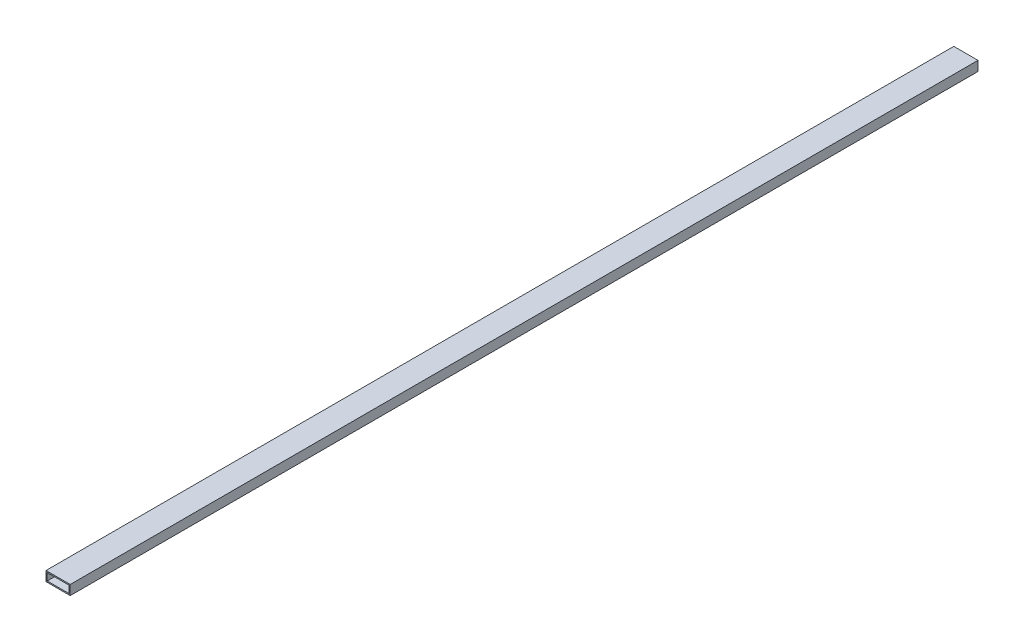
ISO-10303-21;
HEADER;
FILE_DESCRIPTION(('STEP AP214'),'2;1');
FILE_NAME('part.step','',(''),(''),'','','');
FILE_SCHEMA(('AUTOMOTIVE_DESIGN { 1 0 10303 214 1 1 1 1 }'));
ENDSEC;
DATA;
#1=APPLICATION_CONTEXT('core data for automotive mechanical design processes');
#2=APPLICATION_PROTOCOL_DEFINITION('international standard','automotive_design',2000,#1);
#3=PRODUCT_CONTEXT('',#1,'mechanical');
#4=PRODUCT('Part','Part','',(#3));
#5=PRODUCT_RELATED_PRODUCT_CATEGORY('part','',(#4));
#6=PRODUCT_DEFINITION_FORMATION('','',#4);
#7=PRODUCT_DEFINITION_CONTEXT('part definition',#1,'design');
#8=PRODUCT_DEFINITION('design','',#6,#7);
#9=PRODUCT_DEFINITION_SHAPE('','',#8);
#10=(LENGTH_UNIT() NAMED_UNIT(*) SI_UNIT(.MILLI.,.METRE.));
#11=(NAMED_UNIT(*) PLANE_ANGLE_UNIT() SI_UNIT($,.RADIAN.));
#12=(NAMED_UNIT(*) SI_UNIT($,.STERADIAN.) SOLID_ANGLE_UNIT());
#13=UNCERTAINTY_MEASURE_WITH_UNIT(LENGTH_MEASURE(1.E-05),#10,'distance_accuracy_value','');
#14=(GEOMETRIC_REPRESENTATION_CONTEXT(3) GLOBAL_UNCERTAINTY_ASSIGNED_CONTEXT((#13)) GLOBAL_UNIT_ASSIGNED_CONTEXT((#10,
#11,#12)) REPRESENTATION_CONTEXT('',''));
#15=CARTESIAN_POINT('',(0.,0.,0.));
#16=DIRECTION('',(0.,0.,1.));
#17=DIRECTION('',(1.,0.,0.));
#18=AXIS2_PLACEMENT_3D('',#15,#16,#17);
#19=CARTESIAN_POINT('',(0.,0.,375.));
#20=DIRECTION('',(0.,0.,1.));
#21=DIRECTION('',(1.,0.,0.));
#22=AXIS2_PLACEMENT_3D('',#19,#20,#21);
#23=PLANE('',#22);
#24=DIRECTION('',(0.,-1.,0.));
#25=VECTOR('',#24,1.);
#26=CARTESIAN_POINT('',(-10.,4.,375.));
#27=LINE('',#26,#25);
#28=CARTESIAN_POINT('',(-10.,4.,375.));
#29=VERTEX_POINT('',#28);
#30=CARTESIAN_POINT('',(-10.,-4.,375.));
#31=VERTEX_POINT('',#30);
#32=EDGE_CURVE('E136',#29,#31,#27,.T.);
#33=ORIENTED_EDGE('',*,*,#32,.T.);
#34=DIRECTION('',(1.,0.,0.));
#35=VECTOR('',#34,1.);
#36=CARTESIAN_POINT('',(-10.,-4.,375.));
#37=LINE('',#36,#35);
#38=CARTESIAN_POINT('',(10.,-4.,375.));
#39=VERTEX_POINT('',#38);
#40=EDGE_CURVE('E139',#31,#39,#37,.T.);
#41=ORIENTED_EDGE('',*,*,#40,.T.);
#42=DIRECTION('',(0.,1.,0.));
#43=VECTOR('',#42,1.);
#44=CARTESIAN_POINT('',(10.,4.,375.));
#45=LINE('',#44,#43);
#46=CARTESIAN_POINT('',(10.,4.,375.));
#47=VERTEX_POINT('',#46);
#48=EDGE_CURVE('E142',#39,#47,#45,.T.);
#49=ORIENTED_EDGE('',*,*,#48,.T.);
#50=DIRECTION('',(-1.,0.,0.));
#51=VECTOR('',#50,1.);
#52=CARTESIAN_POINT('',(-10.,4.,375.));
#53=LINE('',#52,#51);
#54=EDGE_CURVE('E144',#47,#29,#53,.T.);
#55=ORIENTED_EDGE('',*,*,#54,.T.);
#56=EDGE_LOOP('',(#33,#41,#49,#55));
#57=FACE_BOUND('',#56,.T.);
#58=DIRECTION('',(1.,0.,0.));
#59=VECTOR('',#58,1.);
#60=CARTESIAN_POINT('',(-9.,-3.,375.));
#61=LINE('',#60,#59);
#62=CARTESIAN_POINT('',(-9.,-3.,375.));
#63=VERTEX_POINT('',#62);
#64=CARTESIAN_POINT('',(9.,-3.,375.));
#65=VERTEX_POINT('',#64);
#66=EDGE_CURVE('E108',#63,#65,#61,.T.);
#67=ORIENTED_EDGE('',*,*,#66,.F.);
#68=DIRECTION('',(0.,-1.,0.));
#69=VECTOR('',#68,1.);
#70=CARTESIAN_POINT('',(-9.,3.,375.));
#71=LINE('',#70,#69);
#72=CARTESIAN_POINT('',(-9.,3.,375.));
#73=VERTEX_POINT('',#72);
#74=EDGE_CURVE('E100',#73,#63,#71,.T.);
#75=ORIENTED_EDGE('',*,*,#74,.F.);
#76=DIRECTION('',(-1.,0.,0.));
#77=VECTOR('',#76,1.);
#78=CARTESIAN_POINT('',(-9.,3.,375.));
#79=LINE('',#78,#77);
#80=CARTESIAN_POINT('',(9.,3.,375.));
#81=VERTEX_POINT('',#80);
#82=EDGE_CURVE('E122',#81,#73,#79,.T.);
#83=ORIENTED_EDGE('',*,*,#82,.F.);
#84=DIRECTION('',(0.,1.,0.));
#85=VECTOR('',#84,1.);
#86=CARTESIAN_POINT('',(9.,3.,375.));
#87=LINE('',#86,#85);
#88=EDGE_CURVE('E120',#65,#81,#87,.T.);
#89=ORIENTED_EDGE('',*,*,#88,.F.);
#90=EDGE_LOOP('',(#67,#75,#83,#89));
#91=FACE_BOUND('',#90,.T.);
#92=ADVANCED_FACE('F35',(#57,#91),#23,.T.);
#93=CARTESIAN_POINT('',(0.,0.,-375.));
#94=DIRECTION('',(0.,0.,1.));
#95=DIRECTION('',(1.,0.,0.));
#96=AXIS2_PLACEMENT_3D('',#93,#94,#95);
#97=PLANE('',#96);
#98=DIRECTION('',(0.,-1.,0.));
#99=VECTOR('',#98,1.);
#100=CARTESIAN_POINT('',(-10.,4.,-375.));
#101=LINE('',#100,#99);
#102=CARTESIAN_POINT('',(-10.,4.,-375.));
#103=VERTEX_POINT('',#102);
#104=CARTESIAN_POINT('',(-10.,-4.,-375.));
#105=VERTEX_POINT('',#104);
#106=EDGE_CURVE('E116',#103,#105,#101,.T.);
#107=ORIENTED_EDGE('',*,*,#106,.F.);
#108=DIRECTION('',(-1.,0.,0.));
#109=VECTOR('',#108,1.);
#110=CARTESIAN_POINT('',(-10.,4.,-375.));
#111=LINE('',#110,#109);
#112=CARTESIAN_POINT('',(10.,4.,-375.));
#113=VERTEX_POINT('',#112);
#114=EDGE_CURVE('E140',#113,#103,#111,.T.);
#115=ORIENTED_EDGE('',*,*,#114,.F.);
#116=DIRECTION('',(0.,1.,0.));
#117=VECTOR('',#116,1.);
#118=CARTESIAN_POINT('',(10.,4.,-375.));
#119=LINE('',#118,#117);
#120=CARTESIAN_POINT('',(10.,-4.,-375.));
#121=VERTEX_POINT('',#120);
#122=EDGE_CURVE('E151',#121,#113,#119,.T.);
#123=ORIENTED_EDGE('',*,*,#122,.F.);
#124=DIRECTION('',(1.,0.,0.));
#125=VECTOR('',#124,1.);
#126=CARTESIAN_POINT('',(-10.,-4.,-375.));
#127=LINE('',#126,#125);
#128=EDGE_CURVE('E149',#105,#121,#127,.T.);
#129=ORIENTED_EDGE('',*,*,#128,.F.);
#130=EDGE_LOOP('',(#107,#115,#123,#129));
#131=FACE_BOUND('',#130,.T.);
#132=DIRECTION('',(0.,-1.,0.));
#133=VECTOR('',#132,1.);
#134=CARTESIAN_POINT('',(-9.,3.,-375.));
#135=LINE('',#134,#133);
#136=CARTESIAN_POINT('',(-9.,3.,-375.));
#137=VERTEX_POINT('',#136);
#138=CARTESIAN_POINT('',(-9.,-3.,-375.));
#139=VERTEX_POINT('',#138);
#140=EDGE_CURVE('E58',#137,#139,#135,.T.);
#141=ORIENTED_EDGE('',*,*,#140,.T.);
#142=DIRECTION('',(1.,0.,0.));
#143=VECTOR('',#142,1.);
#144=CARTESIAN_POINT('',(-9.,-3.,-375.));
#145=LINE('',#144,#143);
#146=CARTESIAN_POINT('',(9.,-3.,-375.));
#147=VERTEX_POINT('',#146);
#148=EDGE_CURVE('E115',#139,#147,#145,.T.);
#149=ORIENTED_EDGE('',*,*,#148,.T.);
#150=DIRECTION('',(0.,1.,0.));
#151=VECTOR('',#150,1.);
#152=CARTESIAN_POINT('',(9.,3.,-375.));
#153=LINE('',#152,#151);
#154=CARTESIAN_POINT('',(9.,3.,-375.));
#155=VERTEX_POINT('',#154);
#156=EDGE_CURVE('E128',#147,#155,#153,.T.);
#157=ORIENTED_EDGE('',*,*,#156,.T.);
#158=DIRECTION('',(-1.,0.,0.));
#159=VECTOR('',#158,1.);
#160=CARTESIAN_POINT('',(-9.,3.,-375.));
#161=LINE('',#160,#159);
#162=EDGE_CURVE('E109',#155,#137,#161,.T.);
#163=ORIENTED_EDGE('',*,*,#162,.T.);
#164=EDGE_LOOP('',(#141,#149,#157,#163));
#165=FACE_BOUND('',#164,.T.);
#166=ADVANCED_FACE('F169',(#131,#165),#97,.F.);
#167=CARTESIAN_POINT('',(-10.,4.,375.));
#168=DIRECTION('',(1.,0.,0.));
#169=DIRECTION('',(0.,0.,-1.));
#170=AXIS2_PLACEMENT_3D('',#167,#168,#169);
#171=PLANE('',#170);
#172=ORIENTED_EDGE('',*,*,#106,.T.);
#173=DIRECTION('',(0.,0.,-1.));
#174=VECTOR('',#173,1.);
#175=CARTESIAN_POINT('',(-10.,-4.,375.));
#176=LINE('',#175,#174);
#177=EDGE_CURVE('E11',#31,#105,#176,.T.);
#178=ORIENTED_EDGE('',*,*,#177,.F.);
#179=ORIENTED_EDGE('',*,*,#32,.F.);
#180=DIRECTION('',(0.,0.,-1.));
#181=VECTOR('',#180,1.);
#182=CARTESIAN_POINT('',(-10.,4.,375.));
#183=LINE('',#182,#181);
#184=EDGE_CURVE('E146',#29,#103,#183,.T.);
#185=ORIENTED_EDGE('',*,*,#184,.T.);
#186=EDGE_LOOP('',(#172,#178,#179,#185));
#187=FACE_BOUND('',#186,.T.);
#188=ADVANCED_FACE('F37',(#187),#171,.F.);
#189=CARTESIAN_POINT('',(-10.,-4.,375.));
#190=DIRECTION('',(0.,1.,0.));
#191=DIRECTION('',(0.,0.,1.));
#192=AXIS2_PLACEMENT_3D('',#189,#190,#191);
#193=PLANE('',#192);
#194=ORIENTED_EDGE('',*,*,#128,.T.);
#195=DIRECTION('',(0.,0.,-1.));
#196=VECTOR('',#195,1.);
#197=CARTESIAN_POINT('',(10.,-4.,375.));
#198=LINE('',#197,#196);
#199=EDGE_CURVE('E43',#39,#121,#198,.T.);
#200=ORIENTED_EDGE('',*,*,#199,.F.);
#201=ORIENTED_EDGE('',*,*,#40,.F.);
#202=ORIENTED_EDGE('',*,*,#177,.T.);
#203=EDGE_LOOP('',(#194,#200,#201,#202));
#204=FACE_BOUND('',#203,.T.);
#205=ADVANCED_FACE('F179',(#204),#193,.F.);
#206=CARTESIAN_POINT('',(10.,4.,375.));
#207=DIRECTION('',(-1.,0.,0.));
#208=DIRECTION('',(0.,0.,1.));
#209=AXIS2_PLACEMENT_3D('',#206,#207,#208);
#210=PLANE('',#209);
#211=ORIENTED_EDGE('',*,*,#122,.T.);
#212=DIRECTION('',(0.,0.,-1.));
#213=VECTOR('',#212,1.);
#214=CARTESIAN_POINT('',(10.,4.,375.));
#215=LINE('',#214,#213);
#216=EDGE_CURVE('E156',#47,#113,#215,.T.);
#217=ORIENTED_EDGE('',*,*,#216,.F.);
#218=ORIENTED_EDGE('',*,*,#48,.F.);
#219=ORIENTED_EDGE('',*,*,#199,.T.);
#220=EDGE_LOOP('',(#211,#217,#218,#219));
#221=FACE_BOUND('',#220,.T.);
#222=ADVANCED_FACE('F163',(#221),#210,.F.);
#223=CARTESIAN_POINT('',(-10.,4.,375.));
#224=DIRECTION('',(0.,-1.,0.));
#225=DIRECTION('',(0.,0.,-1.));
#226=AXIS2_PLACEMENT_3D('',#223,#224,#225);
#227=PLANE('',#226);
#228=ORIENTED_EDGE('',*,*,#114,.T.);
#229=ORIENTED_EDGE('',*,*,#184,.F.);
#230=ORIENTED_EDGE('',*,*,#54,.F.);
#231=ORIENTED_EDGE('',*,*,#216,.T.);
#232=EDGE_LOOP('',(#228,#229,#230,#231));
#233=FACE_BOUND('',#232,.T.);
#234=ADVANCED_FACE('F173',(#233),#227,.F.);
#235=CARTESIAN_POINT('',(-9.,3.,375.));
#236=DIRECTION('',(1.,0.,0.));
#237=DIRECTION('',(0.,0.,-1.));
#238=AXIS2_PLACEMENT_3D('',#235,#236,#237);
#239=PLANE('',#238);
#240=ORIENTED_EDGE('',*,*,#140,.F.);
#241=DIRECTION('',(0.,0.,-1.));
#242=VECTOR('',#241,1.);
#243=CARTESIAN_POINT('',(-9.,3.,375.));
#244=LINE('',#243,#242);
#245=EDGE_CURVE('E104',#73,#137,#244,.T.);
#246=ORIENTED_EDGE('',*,*,#245,.F.);
#247=ORIENTED_EDGE('',*,*,#74,.T.);
#248=DIRECTION('',(0.,0.,-1.));
#249=VECTOR('',#248,1.);
#250=CARTESIAN_POINT('',(-9.,-3.,375.));
#251=LINE('',#250,#249);
#252=EDGE_CURVE('E103',#63,#139,#251,.T.);
#253=ORIENTED_EDGE('',*,*,#252,.T.);
#254=EDGE_LOOP('',(#240,#246,#247,#253));
#255=FACE_BOUND('',#254,.T.);
#256=ADVANCED_FACE('F102',(#255),#239,.T.);
#257=CARTESIAN_POINT('',(-9.,-3.,375.));
#258=DIRECTION('',(0.,1.,0.));
#259=DIRECTION('',(0.,0.,1.));
#260=AXIS2_PLACEMENT_3D('',#257,#258,#259);
#261=PLANE('',#260);
#262=ORIENTED_EDGE('',*,*,#148,.F.);
#263=ORIENTED_EDGE('',*,*,#252,.F.);
#264=ORIENTED_EDGE('',*,*,#66,.T.);
#265=DIRECTION('',(0.,0.,-1.));
#266=VECTOR('',#265,1.);
#267=CARTESIAN_POINT('',(9.,-3.,375.));
#268=LINE('',#267,#266);
#269=EDGE_CURVE('E117',#65,#147,#268,.T.);
#270=ORIENTED_EDGE('',*,*,#269,.T.);
#271=EDGE_LOOP('',(#262,#263,#264,#270));
#272=FACE_BOUND('',#271,.T.);
#273=ADVANCED_FACE('F112',(#272),#261,.T.);
#274=CARTESIAN_POINT('',(9.,3.,375.));
#275=DIRECTION('',(-1.,0.,0.));
#276=DIRECTION('',(0.,-1.,0.));
#277=AXIS2_PLACEMENT_3D('',#274,#275,#276);
#278=PLANE('',#277);
#279=ORIENTED_EDGE('',*,*,#156,.F.);
#280=ORIENTED_EDGE('',*,*,#269,.F.);
#281=ORIENTED_EDGE('',*,*,#88,.T.);
#282=DIRECTION('',(0.,0.,-1.));
#283=VECTOR('',#282,1.);
#284=CARTESIAN_POINT('',(9.,3.,375.));
#285=LINE('',#284,#283);
#286=EDGE_CURVE('E50',#81,#155,#285,.T.);
#287=ORIENTED_EDGE('',*,*,#286,.T.);
#288=EDGE_LOOP('',(#279,#280,#281,#287));
#289=FACE_BOUND('',#288,.T.);
#290=ADVANCED_FACE('F202',(#289),#278,.T.);
#291=CARTESIAN_POINT('',(-9.,3.,375.));
#292=DIRECTION('',(0.,-1.,0.));
#293=DIRECTION('',(0.,0.,-1.));
#294=AXIS2_PLACEMENT_3D('',#291,#292,#293);
#295=PLANE('',#294);
#296=ORIENTED_EDGE('',*,*,#162,.F.);
#297=ORIENTED_EDGE('',*,*,#286,.F.);
#298=ORIENTED_EDGE('',*,*,#82,.T.);
#299=ORIENTED_EDGE('',*,*,#245,.T.);
#300=EDGE_LOOP('',(#296,#297,#298,#299));
#301=FACE_BOUND('',#300,.T.);
#302=ADVANCED_FACE('F206',(#301),#295,.T.);
#303=CLOSED_SHELL('',(#92,#166,#188,#205,#222,#234,#256,#273,#290,#302));
#304=MANIFOLD_SOLID_BREP('B2',#303);
#305=ADVANCED_BREP_SHAPE_REPRESENTATION('',(#18,#304),#14);
#306=SHAPE_DEFINITION_REPRESENTATION(#9,#305);
ENDSEC;
END-ISO-10303-21;
